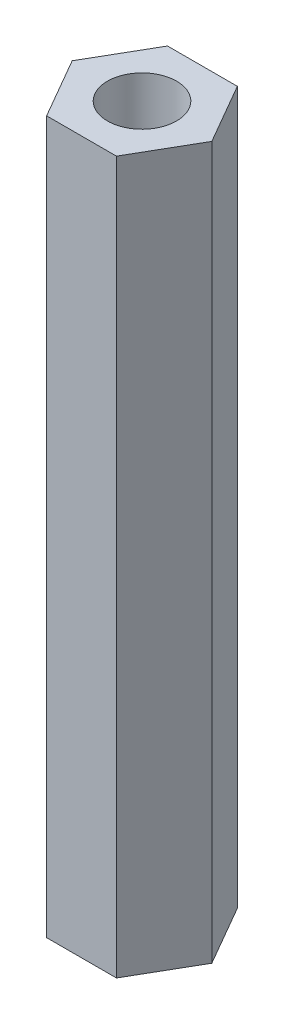
ISO-10303-21;
HEADER;
FILE_DESCRIPTION(('STEP AP214'),'2;1');
FILE_NAME('part.step','',(''),(''),'','','');
FILE_SCHEMA(('AUTOMOTIVE_DESIGN { 1 0 10303 214 1 1 1 1 }'));
ENDSEC;
DATA;
#1=APPLICATION_CONTEXT('core data for automotive mechanical design processes');
#2=APPLICATION_PROTOCOL_DEFINITION('international standard','automotive_design',2000,#1);
#3=PRODUCT_CONTEXT('',#1,'mechanical');
#4=PRODUCT('Part','Part','',(#3));
#5=PRODUCT_RELATED_PRODUCT_CATEGORY('part','',(#4));
#6=PRODUCT_DEFINITION_FORMATION('','',#4);
#7=PRODUCT_DEFINITION_CONTEXT('part definition',#1,'design');
#8=PRODUCT_DEFINITION('design','',#6,#7);
#9=PRODUCT_DEFINITION_SHAPE('','',#8);
#10=(LENGTH_UNIT() NAMED_UNIT(*) SI_UNIT(.MILLI.,.METRE.));
#11=(NAMED_UNIT(*) PLANE_ANGLE_UNIT() SI_UNIT($,.RADIAN.));
#12=(NAMED_UNIT(*) SI_UNIT($,.STERADIAN.) SOLID_ANGLE_UNIT());
#13=UNCERTAINTY_MEASURE_WITH_UNIT(LENGTH_MEASURE(1.E-05),#10,'distance_accuracy_value','');
#14=(GEOMETRIC_REPRESENTATION_CONTEXT(3) GLOBAL_UNCERTAINTY_ASSIGNED_CONTEXT((#13)) GLOBAL_UNIT_ASSIGNED_CONTEXT((#10,
#11,#12)) REPRESENTATION_CONTEXT('',''));
#15=CARTESIAN_POINT('',(0.,0.,0.));
#16=DIRECTION('',(0.,0.,1.));
#17=DIRECTION('',(1.,0.,0.));
#18=AXIS2_PLACEMENT_3D('',#15,#16,#17);
#19=CARTESIAN_POINT('',(0.,41.2,0.));
#20=DIRECTION('',(0.,1.,0.));
#21=DIRECTION('',(0.,0.,1.));
#22=AXIS2_PLACEMENT_3D('',#19,#20,#21);
#23=PLANE('',#22);
#24=DIRECTION('',(-1.,0.,0.));
#25=VECTOR('',#24,1.);
#26=CARTESIAN_POINT('',(2.02072594216369,41.2,-3.5));
#27=LINE('',#26,#25);
#28=CARTESIAN_POINT('',(2.02072594216369,41.2,-3.5));
#29=VERTEX_POINT('',#28);
#30=CARTESIAN_POINT('',(-2.02072594216369,41.2,-3.5));
#31=VERTEX_POINT('',#30);
#32=EDGE_CURVE('E152',#29,#31,#27,.T.);
#33=ORIENTED_EDGE('',*,*,#32,.T.);
#34=DIRECTION('',(-0.5,0.,0.866025403784439));
#35=VECTOR('',#34,1.);
#36=CARTESIAN_POINT('',(-2.02072594216369,41.2,-3.5));
#37=LINE('',#36,#35);
#38=CARTESIAN_POINT('',(-4.04145188432738,41.2,0.));
#39=VERTEX_POINT('',#38);
#40=EDGE_CURVE('E100',#31,#39,#37,.T.);
#41=ORIENTED_EDGE('',*,*,#40,.T.);
#42=DIRECTION('',(0.5,0.,0.866025403784439));
#43=VECTOR('',#42,1.);
#44=CARTESIAN_POINT('',(-4.04145188432738,41.2,0.));
#45=LINE('',#44,#43);
#46=CARTESIAN_POINT('',(-2.02072594216369,41.2,3.50000000000001));
#47=VERTEX_POINT('',#46);
#48=EDGE_CURVE('E113',#39,#47,#45,.T.);
#49=ORIENTED_EDGE('',*,*,#48,.T.);
#50=DIRECTION('',(1.,0.,0.));
#51=VECTOR('',#50,1.);
#52=CARTESIAN_POINT('',(-2.02072594216369,41.2,3.50000000000001));
#53=LINE('',#52,#51);
#54=CARTESIAN_POINT('',(2.02072594216369,41.2,3.5));
#55=VERTEX_POINT('',#54);
#56=EDGE_CURVE('E107',#47,#55,#53,.T.);
#57=ORIENTED_EDGE('',*,*,#56,.T.);
#58=DIRECTION('',(0.5,0.,-0.866025403784438));
#59=VECTOR('',#58,1.);
#60=CARTESIAN_POINT('',(2.02072594216369,41.2,3.5));
#61=LINE('',#60,#59);
#62=CARTESIAN_POINT('',(4.04145188432739,41.2,0.));
#63=VERTEX_POINT('',#62);
#64=EDGE_CURVE('E111',#55,#63,#61,.T.);
#65=ORIENTED_EDGE('',*,*,#64,.T.);
#66=DIRECTION('',(-0.5,0.,-0.866025403784438));
#67=VECTOR('',#66,1.);
#68=CARTESIAN_POINT('',(4.04145188432739,41.2,0.));
#69=LINE('',#68,#67);
#70=EDGE_CURVE('E63',#63,#29,#69,.T.);
#71=ORIENTED_EDGE('',*,*,#70,.T.);
#72=EDGE_LOOP('',(#33,#41,#49,#57,#65,#71));
#73=FACE_BOUND('',#72,.T.);
#74=CARTESIAN_POINT('',(0.,41.2,0.));
#75=DIRECTION('',(0.,1.,0.));
#76=DIRECTION('',(0.,0.,1.));
#77=AXIS2_PLACEMENT_3D('',#74,#75,#76);
#78=CIRCLE('',#77,2.);
#79=CARTESIAN_POINT('',(0.,41.2,-2.));
#80=VERTEX_POINT('',#79);
#81=EDGE_CURVE('E140',#80,#80,#78,.T.);
#82=ORIENTED_EDGE('',*,*,#81,.F.);
#83=EDGE_LOOP('',(#82));
#84=FACE_BOUND('',#83,.T.);
#85=ADVANCED_FACE('F45',(#73,#84),#23,.T.);
#86=CARTESIAN_POINT('',(0.,0.,0.));
#87=DIRECTION('',(0.,1.,0.));
#88=DIRECTION('',(0.,0.,1.));
#89=AXIS2_PLACEMENT_3D('',#86,#87,#88);
#90=PLANE('',#89);
#91=DIRECTION('',(-1.,0.,0.));
#92=VECTOR('',#91,1.);
#93=CARTESIAN_POINT('',(2.02072594216369,0.,-3.5));
#94=LINE('',#93,#92);
#95=CARTESIAN_POINT('',(2.02072594216369,0.,-3.5));
#96=VERTEX_POINT('',#95);
#97=CARTESIAN_POINT('',(-2.02072594216369,0.,-3.5));
#98=VERTEX_POINT('',#97);
#99=EDGE_CURVE('E135',#96,#98,#94,.T.);
#100=ORIENTED_EDGE('',*,*,#99,.F.);
#101=DIRECTION('',(-0.5,0.,-0.866025403784438));
#102=VECTOR('',#101,1.);
#103=CARTESIAN_POINT('',(4.04145188432739,0.,0.));
#104=LINE('',#103,#102);
#105=CARTESIAN_POINT('',(4.04145188432739,0.,0.));
#106=VERTEX_POINT('',#105);
#107=EDGE_CURVE('E92',#106,#96,#104,.T.);
#108=ORIENTED_EDGE('',*,*,#107,.F.);
#109=DIRECTION('',(0.5,0.,-0.866025403784438));
#110=VECTOR('',#109,1.);
#111=CARTESIAN_POINT('',(2.02072594216369,0.,3.5));
#112=LINE('',#111,#110);
#113=CARTESIAN_POINT('',(2.02072594216369,0.,3.5));
#114=VERTEX_POINT('',#113);
#115=EDGE_CURVE('E86',#114,#106,#112,.T.);
#116=ORIENTED_EDGE('',*,*,#115,.F.);
#117=DIRECTION('',(1.,0.,0.));
#118=VECTOR('',#117,1.);
#119=CARTESIAN_POINT('',(-2.02072594216369,0.,3.50000000000001));
#120=LINE('',#119,#118);
#121=CARTESIAN_POINT('',(-2.02072594216369,0.,3.50000000000001));
#122=VERTEX_POINT('',#121);
#123=EDGE_CURVE('E122',#122,#114,#120,.T.);
#124=ORIENTED_EDGE('',*,*,#123,.F.);
#125=DIRECTION('',(0.5,0.,0.866025403784439));
#126=VECTOR('',#125,1.);
#127=CARTESIAN_POINT('',(-4.04145188432738,0.,0.));
#128=LINE('',#127,#126);
#129=CARTESIAN_POINT('',(-4.04145188432738,0.,0.));
#130=VERTEX_POINT('',#129);
#131=EDGE_CURVE('E143',#130,#122,#128,.T.);
#132=ORIENTED_EDGE('',*,*,#131,.F.);
#133=DIRECTION('',(-0.5,0.,0.866025403784439));
#134=VECTOR('',#133,1.);
#135=CARTESIAN_POINT('',(-2.02072594216369,0.,-3.5));
#136=LINE('',#135,#134);
#137=EDGE_CURVE('E139',#98,#130,#136,.T.);
#138=ORIENTED_EDGE('',*,*,#137,.F.);
#139=EDGE_LOOP('',(#100,#108,#116,#124,#132,#138));
#140=FACE_BOUND('',#139,.T.);
#141=CARTESIAN_POINT('',(0.,0.,0.));
#142=DIRECTION('',(0.,1.,0.));
#143=DIRECTION('',(0.,0.,1.));
#144=AXIS2_PLACEMENT_3D('',#141,#142,#143);
#145=CIRCLE('',#144,2.);
#146=CARTESIAN_POINT('',(0.,0.,-2.));
#147=VERTEX_POINT('',#146);
#148=EDGE_CURVE('E249',#147,#147,#145,.T.);
#149=ORIENTED_EDGE('',*,*,#148,.T.);
#150=EDGE_LOOP('',(#149));
#151=FACE_BOUND('',#150,.T.);
#152=ADVANCED_FACE('F165',(#140,#151),#90,.F.);
#153=CARTESIAN_POINT('',(2.02072594216369,41.2,-3.5));
#154=DIRECTION('',(0.,0.,1.));
#155=DIRECTION('',(1.,0.,0.));
#156=AXIS2_PLACEMENT_3D('',#153,#154,#155);
#157=PLANE('',#156);
#158=ORIENTED_EDGE('',*,*,#99,.T.);
#159=DIRECTION('',(0.,-1.,0.));
#160=VECTOR('',#159,1.);
#161=CARTESIAN_POINT('',(-2.02072594216369,41.2,-3.5));
#162=LINE('',#161,#160);
#163=EDGE_CURVE('E11',#31,#98,#162,.T.);
#164=ORIENTED_EDGE('',*,*,#163,.F.);
#165=ORIENTED_EDGE('',*,*,#32,.F.);
#166=DIRECTION('',(0.,-1.,0.));
#167=VECTOR('',#166,1.);
#168=CARTESIAN_POINT('',(2.02072594216369,41.2,-3.5));
#169=LINE('',#168,#167);
#170=EDGE_CURVE('E131',#29,#96,#169,.T.);
#171=ORIENTED_EDGE('',*,*,#170,.T.);
#172=EDGE_LOOP('',(#158,#164,#165,#171));
#173=FACE_BOUND('',#172,.T.);
#174=ADVANCED_FACE('F47',(#173),#157,.F.);
#175=CARTESIAN_POINT('',(-2.02072594216369,41.2,-3.5));
#176=DIRECTION('',(0.866025403784439,0.,0.5));
#177=DIRECTION('',(0.5,0.,-0.866025403784439));
#178=AXIS2_PLACEMENT_3D('',#175,#176,#177);
#179=PLANE('',#178);
#180=ORIENTED_EDGE('',*,*,#137,.T.);
#181=DIRECTION('',(0.,-1.,0.));
#182=VECTOR('',#181,1.);
#183=CARTESIAN_POINT('',(-4.04145188432738,41.2,0.));
#184=LINE('',#183,#182);
#185=EDGE_CURVE('E55',#39,#130,#184,.T.);
#186=ORIENTED_EDGE('',*,*,#185,.F.);
#187=ORIENTED_EDGE('',*,*,#40,.F.);
#188=ORIENTED_EDGE('',*,*,#163,.T.);
#189=EDGE_LOOP('',(#180,#186,#187,#188));
#190=FACE_BOUND('',#189,.T.);
#191=ADVANCED_FACE('F190',(#190),#179,.F.);
#192=CARTESIAN_POINT('',(-4.04145188432738,41.2,0.));
#193=DIRECTION('',(0.866025403784439,0.,-0.5));
#194=DIRECTION('',(-0.5,0.,-0.866025403784439));
#195=AXIS2_PLACEMENT_3D('',#192,#193,#194);
#196=PLANE('',#195);
#197=ORIENTED_EDGE('',*,*,#131,.T.);
#198=DIRECTION('',(0.,-1.,0.));
#199=VECTOR('',#198,1.);
#200=CARTESIAN_POINT('',(-2.02072594216369,41.2,3.50000000000001));
#201=LINE('',#200,#199);
#202=EDGE_CURVE('E124',#47,#122,#201,.T.);
#203=ORIENTED_EDGE('',*,*,#202,.F.);
#204=ORIENTED_EDGE('',*,*,#48,.F.);
#205=ORIENTED_EDGE('',*,*,#185,.T.);
#206=EDGE_LOOP('',(#197,#203,#204,#205));
#207=FACE_BOUND('',#206,.T.);
#208=ADVANCED_FACE('F162',(#207),#196,.F.);
#209=CARTESIAN_POINT('',(-2.02072594216369,41.2,3.50000000000001));
#210=DIRECTION('',(0.,0.,-1.));
#211=DIRECTION('',(-1.,0.,0.));
#212=AXIS2_PLACEMENT_3D('',#209,#210,#211);
#213=PLANE('',#212);
#214=ORIENTED_EDGE('',*,*,#123,.T.);
#215=DIRECTION('',(0.,-1.,0.));
#216=VECTOR('',#215,1.);
#217=CARTESIAN_POINT('',(2.02072594216369,41.2,3.5));
#218=LINE('',#217,#216);
#219=EDGE_CURVE('E119',#55,#114,#218,.T.);
#220=ORIENTED_EDGE('',*,*,#219,.F.);
#221=ORIENTED_EDGE('',*,*,#56,.F.);
#222=ORIENTED_EDGE('',*,*,#202,.T.);
#223=EDGE_LOOP('',(#214,#220,#221,#222));
#224=FACE_BOUND('',#223,.T.);
#225=ADVANCED_FACE('F120',(#224),#213,.F.);
#226=CARTESIAN_POINT('',(2.02072594216369,41.2,3.5));
#227=DIRECTION('',(-0.866025403784439,0.,-0.5));
#228=DIRECTION('',(-0.5,0.,0.866025403784438));
#229=AXIS2_PLACEMENT_3D('',#226,#227,#228);
#230=PLANE('',#229);
#231=ORIENTED_EDGE('',*,*,#115,.T.);
#232=DIRECTION('',(0.,-1.,0.));
#233=VECTOR('',#232,1.);
#234=CARTESIAN_POINT('',(4.04145188432739,41.2,0.));
#235=LINE('',#234,#233);
#236=EDGE_CURVE('E125',#63,#106,#235,.T.);
#237=ORIENTED_EDGE('',*,*,#236,.F.);
#238=ORIENTED_EDGE('',*,*,#64,.F.);
#239=ORIENTED_EDGE('',*,*,#219,.T.);
#240=EDGE_LOOP('',(#231,#237,#238,#239));
#241=FACE_BOUND('',#240,.T.);
#242=ADVANCED_FACE('F127',(#241),#230,.F.);
#243=CARTESIAN_POINT('',(4.04145188432739,41.2,0.));
#244=DIRECTION('',(-0.866025403784438,0.,0.5));
#245=DIRECTION('',(0.5,0.,0.866025403784438));
#246=AXIS2_PLACEMENT_3D('',#243,#244,#245);
#247=PLANE('',#246);
#248=ORIENTED_EDGE('',*,*,#107,.T.);
#249=ORIENTED_EDGE('',*,*,#170,.F.);
#250=ORIENTED_EDGE('',*,*,#70,.F.);
#251=ORIENTED_EDGE('',*,*,#236,.T.);
#252=EDGE_LOOP('',(#248,#249,#250,#251));
#253=FACE_BOUND('',#252,.T.);
#254=ADVANCED_FACE('F170',(#253),#247,.F.);
#255=CARTESIAN_POINT('',(0.,41.2,0.));
#256=DIRECTION('',(0.,-1.,0.));
#257=DIRECTION('',(0.,0.,-1.));
#258=AXIS2_PLACEMENT_3D('',#255,#256,#257);
#259=CYLINDRICAL_SURFACE('',#258,2.);
#260=CARTESIAN_POINT('',(0.,41.2,-2.));
#261=CARTESIAN_POINT('',(0.,40.7708333333333,-2.));
#262=CARTESIAN_POINT('',(0.,40.3416666666667,-2.));
#263=CARTESIAN_POINT('',(0.,39.4833333333333,-2.));
#264=CARTESIAN_POINT('',(0.,39.0541666666667,-2.));
#265=CARTESIAN_POINT('',(0.,38.1958333333333,-2.));
#266=CARTESIAN_POINT('',(0.,37.7666666666667,-2.));
#267=CARTESIAN_POINT('',(0.,36.9083333333333,-2.));
#268=CARTESIAN_POINT('',(0.,36.4791666666667,-2.));
#269=CARTESIAN_POINT('',(0.,35.6208333333333,-2.));
#270=CARTESIAN_POINT('',(0.,35.1916666666667,-2.));
#271=CARTESIAN_POINT('',(0.,34.3333333333333,-2.));
#272=CARTESIAN_POINT('',(0.,33.9041666666667,-2.));
#273=CARTESIAN_POINT('',(0.,33.0458333333333,-2.));
#274=CARTESIAN_POINT('',(0.,32.6166666666667,-2.));
#275=CARTESIAN_POINT('',(0.,31.7583333333333,-2.));
#276=CARTESIAN_POINT('',(0.,31.3291666666667,-2.));
#277=CARTESIAN_POINT('',(0.,30.4708333333333,-2.));
#278=CARTESIAN_POINT('',(0.,30.0416666666667,-2.));
#279=CARTESIAN_POINT('',(0.,29.1833333333333,-2.));
#280=CARTESIAN_POINT('',(0.,28.7541666666667,-2.));
#281=CARTESIAN_POINT('',(0.,27.8958333333333,-2.));
#282=CARTESIAN_POINT('',(0.,27.4666666666667,-2.));
#283=CARTESIAN_POINT('',(0.,26.6083333333333,-2.));
#284=CARTESIAN_POINT('',(0.,26.1791666666667,-2.));
#285=CARTESIAN_POINT('',(0.,25.3208333333333,-2.));
#286=CARTESIAN_POINT('',(0.,24.8916666666667,-2.));
#287=CARTESIAN_POINT('',(0.,24.0333333333333,-2.));
#288=CARTESIAN_POINT('',(0.,23.6041666666667,-2.));
#289=CARTESIAN_POINT('',(0.,22.7458333333333,-2.));
#290=CARTESIAN_POINT('',(0.,22.3166666666667,-2.));
#291=CARTESIAN_POINT('',(0.,21.4583333333333,-2.));
#292=CARTESIAN_POINT('',(0.,21.0291666666667,-2.));
#293=CARTESIAN_POINT('',(0.,20.1708333333333,-2.));
#294=CARTESIAN_POINT('',(0.,19.7416666666667,-2.));
#295=CARTESIAN_POINT('',(0.,18.8833333333333,-2.));
#296=CARTESIAN_POINT('',(0.,18.4541666666667,-2.));
#297=CARTESIAN_POINT('',(0.,17.5958333333333,-2.));
#298=CARTESIAN_POINT('',(0.,17.1666666666667,-2.));
#299=CARTESIAN_POINT('',(0.,16.3083333333333,-2.));
#300=CARTESIAN_POINT('',(0.,15.8791666666667,-2.));
#301=CARTESIAN_POINT('',(0.,15.0208333333333,-2.));
#302=CARTESIAN_POINT('',(0.,14.5916666666667,-2.));
#303=CARTESIAN_POINT('',(0.,13.7333333333333,-2.));
#304=CARTESIAN_POINT('',(0.,13.3041666666667,-2.));
#305=CARTESIAN_POINT('',(0.,12.4458333333333,-2.));
#306=CARTESIAN_POINT('',(0.,12.0166666666667,-2.));
#307=CARTESIAN_POINT('',(0.,11.1583333333333,-2.));
#308=CARTESIAN_POINT('',(0.,10.7291666666667,-2.));
#309=CARTESIAN_POINT('',(0.,9.87083333333333,-2.));
#310=CARTESIAN_POINT('',(0.,9.44166666666666,-2.));
#311=CARTESIAN_POINT('',(0.,8.58333333333333,-2.));
#312=CARTESIAN_POINT('',(0.,8.15416666666666,-2.));
#313=CARTESIAN_POINT('',(0.,7.29583333333333,-2.));
#314=CARTESIAN_POINT('',(0.,6.86666666666666,-2.));
#315=CARTESIAN_POINT('',(0.,6.00833333333333,-2.));
#316=CARTESIAN_POINT('',(0.,5.57916666666666,-2.));
#317=CARTESIAN_POINT('',(0.,4.72083333333333,-2.));
#318=CARTESIAN_POINT('',(0.,4.29166666666666,-2.));
#319=CARTESIAN_POINT('',(0.,3.43333333333333,-2.));
#320=CARTESIAN_POINT('',(0.,3.00416666666666,-2.));
#321=CARTESIAN_POINT('',(0.,2.14583333333333,-2.));
#322=CARTESIAN_POINT('',(0.,1.71666666666666,-2.));
#323=CARTESIAN_POINT('',(0.,0.858333333333325,-2.));
#324=CARTESIAN_POINT('',(0.,0.429166666666659,-2.));
#325=CARTESIAN_POINT('',(0.,0.,-2.));
#326=B_SPLINE_CURVE_WITH_KNOTS('',3,(#260,#261,#262,#263,#264,#265,#266,#267,#268,#269,#270,
#271,#272,#273,#274,#275,#276,#277,#278,#279,#280,#281,#282,#283,#284,#285,#286,#287,#288,#289,
#290,#291,#292,#293,#294,#295,#296,#297,#298,#299,#300,#301,#302,#303,#304,#305,#306,#307,#308,
#309,#310,#311,#312,#313,#314,#315,#316,#317,#318,#319,#320,#321,#322,#323,#324,#325),
.UNSPECIFIED.,.F.,.F.,(4,2,2,2,2,2,2,2,2,2,2,2,2,2,2,2,2,2,2,2,2,2,2,2,2,2,2,2,2,2,2,2,4),(0.,
1.2875,2.575,3.8625,5.15,6.43750000000001,7.725,9.01250000000001,10.3,11.5875,12.875,14.1625,
15.45,16.7375,18.025,19.3125,20.6,21.8875,23.175,24.4625,25.75,27.0375,28.325,29.6125,30.9,
32.1875,33.475,34.7625,36.05,37.3375,38.625,39.9125,41.2),.UNSPECIFIED.);
#327=EDGE_CURVE('BSEAM172',#80,#147,#326,.T.);
#328=ORIENTED_EDGE('',*,*,#81,.T.);
#329=ORIENTED_EDGE('',*,*,#148,.F.);
#330=ORIENTED_EDGE('',*,*,#327,.T.);
#331=ORIENTED_EDGE('',*,*,#327,.F.);
#332=EDGE_LOOP('',(#328,#330,#329,#331));
#333=FACE_BOUND('',#332,.T.);
#334=ADVANCED_FACE('F172',(#333),#259,.F.);
#335=CLOSED_SHELL('',(#85,#152,#174,#191,#208,#225,#242,#254,#334));
#336=MANIFOLD_SOLID_BREP('B2',#335);
#337=ADVANCED_BREP_SHAPE_REPRESENTATION('',(#18,#336),#14);
#338=SHAPE_DEFINITION_REPRESENTATION(#9,#337);
ENDSEC;
END-ISO-10303-21;
